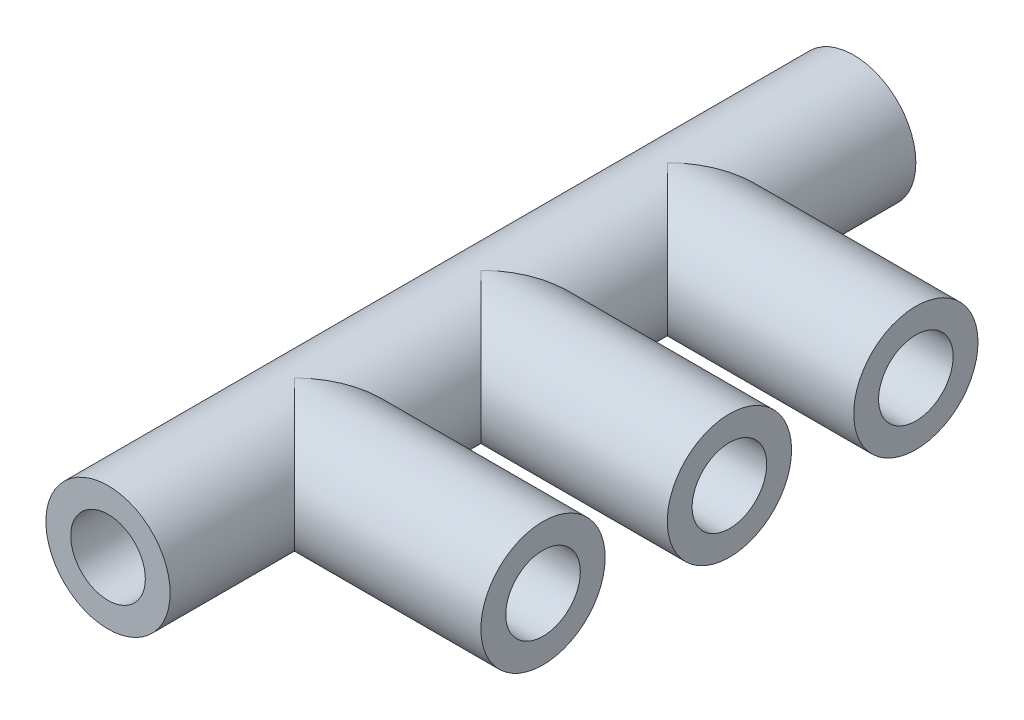
ISO-10303-21;
HEADER;
FILE_DESCRIPTION(('STEP AP214'),'2;1');
FILE_NAME('part.step','',(''),(''),'','','');
FILE_SCHEMA(('AUTOMOTIVE_DESIGN { 1 0 10303 214 1 1 1 1 }'));
ENDSEC;
DATA;
#1=APPLICATION_CONTEXT('core data for automotive mechanical design processes');
#2=APPLICATION_PROTOCOL_DEFINITION('international standard','automotive_design',2000,#1);
#3=PRODUCT_CONTEXT('',#1,'mechanical');
#4=PRODUCT('Part','Part','',(#3));
#5=PRODUCT_RELATED_PRODUCT_CATEGORY('part','',(#4));
#6=PRODUCT_DEFINITION_FORMATION('','',#4);
#7=PRODUCT_DEFINITION_CONTEXT('part definition',#1,'design');
#8=PRODUCT_DEFINITION('design','',#6,#7);
#9=PRODUCT_DEFINITION_SHAPE('','',#8);
#10=(LENGTH_UNIT() NAMED_UNIT(*) SI_UNIT(.MILLI.,.METRE.));
#11=(NAMED_UNIT(*) PLANE_ANGLE_UNIT() SI_UNIT($,.RADIAN.));
#12=(NAMED_UNIT(*) SI_UNIT($,.STERADIAN.) SOLID_ANGLE_UNIT());
#13=UNCERTAINTY_MEASURE_WITH_UNIT(LENGTH_MEASURE(1.E-05),#10,'distance_accuracy_value','');
#14=(GEOMETRIC_REPRESENTATION_CONTEXT(3) GLOBAL_UNCERTAINTY_ASSIGNED_CONTEXT((#13)) GLOBAL_UNIT_ASSIGNED_CONTEXT((#10,
#11,#12)) REPRESENTATION_CONTEXT('',''));
#15=CARTESIAN_POINT('',(0.,0.,0.));
#16=DIRECTION('',(0.,0.,1.));
#17=DIRECTION('',(1.,0.,0.));
#18=AXIS2_PLACEMENT_3D('',#15,#16,#17);
#19=CARTESIAN_POINT('',(0.,0.,60.));
#20=DIRECTION('',(0.,0.,-1.));
#21=DIRECTION('',(-1.,0.,0.));
#22=AXIS2_PLACEMENT_3D('',#19,#20,#21);
#23=CYLINDRICAL_SURFACE('',#22,5.);
#24=CARTESIAN_POINT('',(0.,0.,30.));
#25=DIRECTION('',(-0.707106781186547,0.,-0.707106781186547));
#26=DIRECTION('',(0.707106781186547,0.,-0.707106781186547));
#27=AXIS2_PLACEMENT_3D('',#24,#25,#26);
#28=ELLIPSE('',#27,7.07106781186547,5.);
#29=CARTESIAN_POINT('',(0.,-5.,30.));
#30=VERTEX_POINT('',#29);
#31=CARTESIAN_POINT('',(0.,5.,30.));
#32=VERTEX_POINT('',#31);
#33=EDGE_CURVE('E141',#30,#32,#28,.F.);
#34=ORIENTED_EDGE('',*,*,#33,.F.);
#35=CARTESIAN_POINT('',(0.,0.,30.));
#36=DIRECTION('',(0.707106781186547,0.,-0.707106781186547));
#37=DIRECTION('',(-0.707106781186547,0.,-0.707106781186547));
#38=AXIS2_PLACEMENT_3D('',#35,#36,#37);
#39=ELLIPSE('',#38,7.07106781186547,5.);
#40=EDGE_CURVE('E51',#32,#30,#39,.T.);
#41=ORIENTED_EDGE('',*,*,#40,.F.);
#42=EDGE_LOOP('',(#34,#41));
#43=FACE_BOUND('',#42,.T.);
#44=CARTESIAN_POINT('',(0.,0.,0.));
#45=DIRECTION('',(0.,0.,1.));
#46=DIRECTION('',(1.,0.,0.));
#47=AXIS2_PLACEMENT_3D('',#44,#45,#46);
#48=CIRCLE('',#47,5.);
#49=CARTESIAN_POINT('',(5.,0.,0.));
#50=VERTEX_POINT('',#49);
#51=EDGE_CURVE('E128',#50,#50,#48,.T.);
#52=ORIENTED_EDGE('',*,*,#51,.T.);
#53=EDGE_LOOP('',(#52));
#54=FACE_BOUND('',#53,.T.);
#55=CARTESIAN_POINT('',(0.,0.,60.));
#56=DIRECTION('',(0.,0.,1.));
#57=DIRECTION('',(1.,0.,0.));
#58=AXIS2_PLACEMENT_3D('',#55,#56,#57);
#59=CIRCLE('',#58,5.);
#60=CARTESIAN_POINT('',(5.,0.,60.));
#61=VERTEX_POINT('',#60);
#62=EDGE_CURVE('E129',#61,#61,#59,.T.);
#63=ORIENTED_EDGE('',*,*,#62,.F.);
#64=EDGE_LOOP('',(#63));
#65=FACE_BOUND('',#64,.T.);
#66=CARTESIAN_POINT('',(0.,0.,15.));
#67=DIRECTION('',(-0.707106781186547,0.,-0.707106781186547));
#68=DIRECTION('',(0.707106781186547,0.,-0.707106781186547));
#69=AXIS2_PLACEMENT_3D('',#66,#67,#68);
#70=ELLIPSE('',#69,7.07106781186547,5.);
#71=CARTESIAN_POINT('',(0.,-5.,15.));
#72=VERTEX_POINT('',#71);
#73=CARTESIAN_POINT('',(0.,5.,15.));
#74=VERTEX_POINT('',#73);
#75=EDGE_CURVE('E137',#72,#74,#70,.F.);
#76=ORIENTED_EDGE('',*,*,#75,.F.);
#77=CARTESIAN_POINT('',(0.,0.,15.));
#78=DIRECTION('',(0.707106781186547,0.,-0.707106781186547));
#79=DIRECTION('',(-0.707106781186547,0.,-0.707106781186547));
#80=AXIS2_PLACEMENT_3D('',#77,#78,#79);
#81=ELLIPSE('',#80,7.07106781186547,5.);
#82=EDGE_CURVE('E132',#74,#72,#81,.T.);
#83=ORIENTED_EDGE('',*,*,#82,.F.);
#84=EDGE_LOOP('',(#76,#83));
#85=FACE_BOUND('',#84,.T.);
#86=CARTESIAN_POINT('',(0.,0.,45.));
#87=DIRECTION('',(-0.707106781186547,0.,-0.707106781186547));
#88=DIRECTION('',(0.707106781186547,0.,-0.707106781186547));
#89=AXIS2_PLACEMENT_3D('',#86,#87,#88);
#90=ELLIPSE('',#89,7.07106781186547,5.);
#91=CARTESIAN_POINT('',(0.,-5.,45.));
#92=VERTEX_POINT('',#91);
#93=CARTESIAN_POINT('',(0.,5.,45.));
#94=VERTEX_POINT('',#93);
#95=EDGE_CURVE('E11',#92,#94,#90,.F.);
#96=ORIENTED_EDGE('',*,*,#95,.F.);
#97=CARTESIAN_POINT('',(0.,0.,45.));
#98=DIRECTION('',(0.707106781186547,0.,-0.707106781186547));
#99=DIRECTION('',(-0.707106781186547,0.,-0.707106781186547));
#100=AXIS2_PLACEMENT_3D('',#97,#98,#99);
#101=ELLIPSE('',#100,7.07106781186547,5.);
#102=EDGE_CURVE('E40',#94,#92,#101,.T.);
#103=ORIENTED_EDGE('',*,*,#102,.F.);
#104=EDGE_LOOP('',(#96,#103));
#105=FACE_BOUND('',#104,.T.);
#106=ADVANCED_FACE('F33',(#43,#54,#65,#85,#105),#23,.T.);
#107=CARTESIAN_POINT('',(0.,0.,60.));
#108=DIRECTION('',(0.,0.,1.));
#109=DIRECTION('',(1.,0.,0.));
#110=AXIS2_PLACEMENT_3D('',#107,#108,#109);
#111=PLANE('',#110);
#112=CARTESIAN_POINT('',(0.,0.,60.));
#113=DIRECTION('',(0.,0.,1.));
#114=DIRECTION('',(1.,0.,0.));
#115=AXIS2_PLACEMENT_3D('',#112,#113,#114);
#116=CIRCLE('',#115,3.);
#117=CARTESIAN_POINT('',(3.,0.,60.));
#118=VERTEX_POINT('',#117);
#119=EDGE_CURVE('E99',#118,#118,#116,.T.);
#120=ORIENTED_EDGE('',*,*,#119,.F.);
#121=EDGE_LOOP('',(#120));
#122=FACE_BOUND('',#121,.T.);
#123=ORIENTED_EDGE('',*,*,#62,.T.);
#124=EDGE_LOOP('',(#123));
#125=FACE_BOUND('',#124,.T.);
#126=ADVANCED_FACE('F145',(#122,#125),#111,.T.);
#127=CARTESIAN_POINT('',(0.,0.,0.));
#128=DIRECTION('',(0.,0.,1.));
#129=DIRECTION('',(1.,0.,0.));
#130=AXIS2_PLACEMENT_3D('',#127,#128,#129);
#131=PLANE('',#130);
#132=CARTESIAN_POINT('',(0.,0.,0.));
#133=DIRECTION('',(0.,0.,1.));
#134=DIRECTION('',(1.,0.,0.));
#135=AXIS2_PLACEMENT_3D('',#132,#133,#134);
#136=CIRCLE('',#135,3.);
#137=CARTESIAN_POINT('',(3.,0.,0.));
#138=VERTEX_POINT('',#137);
#139=EDGE_CURVE('E106',#138,#138,#136,.T.);
#140=ORIENTED_EDGE('',*,*,#139,.T.);
#141=EDGE_LOOP('',(#140));
#142=FACE_BOUND('',#141,.T.);
#143=ORIENTED_EDGE('',*,*,#51,.F.);
#144=EDGE_LOOP('',(#143));
#145=FACE_BOUND('',#144,.T.);
#146=ADVANCED_FACE('F149',(#142,#145),#131,.F.);
#147=CARTESIAN_POINT('',(20.,0.,15.));
#148=DIRECTION('',(-1.,0.,0.));
#149=DIRECTION('',(0.,0.,1.));
#150=AXIS2_PLACEMENT_3D('',#147,#148,#149);
#151=CYLINDRICAL_SURFACE('',#150,5.);
#152=CARTESIAN_POINT('',(20.,0.,15.));
#153=DIRECTION('',(1.,0.,0.));
#154=DIRECTION('',(0.,0.,-1.));
#155=AXIS2_PLACEMENT_3D('',#152,#153,#154);
#156=CIRCLE('',#155,5.);
#157=CARTESIAN_POINT('',(20.,0.,10.));
#158=VERTEX_POINT('',#157);
#159=EDGE_CURVE('E125',#158,#158,#156,.T.);
#160=ORIENTED_EDGE('',*,*,#159,.F.);
#161=EDGE_LOOP('',(#160));
#162=FACE_BOUND('',#161,.T.);
#163=ORIENTED_EDGE('',*,*,#82,.T.);
#164=ORIENTED_EDGE('',*,*,#75,.T.);
#165=EDGE_LOOP('',(#163,#164));
#166=FACE_BOUND('',#165,.T.);
#167=ADVANCED_FACE('F158',(#162,#166),#151,.T.);
#168=CARTESIAN_POINT('',(20.,0.,15.));
#169=DIRECTION('',(1.,0.,0.));
#170=DIRECTION('',(0.,0.,-1.));
#171=AXIS2_PLACEMENT_3D('',#168,#169,#170);
#172=PLANE('',#171);
#173=CARTESIAN_POINT('',(20.,0.,15.));
#174=DIRECTION('',(1.,0.,0.));
#175=DIRECTION('',(0.,0.,-1.));
#176=AXIS2_PLACEMENT_3D('',#173,#174,#175);
#177=CIRCLE('',#176,3.);
#178=CARTESIAN_POINT('',(20.,0.,12.));
#179=VERTEX_POINT('',#178);
#180=EDGE_CURVE('E109',#179,#179,#177,.T.);
#181=ORIENTED_EDGE('',*,*,#180,.F.);
#182=EDGE_LOOP('',(#181));
#183=FACE_BOUND('',#182,.T.);
#184=ORIENTED_EDGE('',*,*,#159,.T.);
#185=EDGE_LOOP('',(#184));
#186=FACE_BOUND('',#185,.T.);
#187=ADVANCED_FACE('F160',(#183,#186),#172,.T.);
#188=CARTESIAN_POINT('',(20.,0.,30.));
#189=DIRECTION('',(-1.,0.,0.));
#190=DIRECTION('',(0.,0.,1.));
#191=AXIS2_PLACEMENT_3D('',#188,#189,#190);
#192=CYLINDRICAL_SURFACE('',#191,5.);
#193=CARTESIAN_POINT('',(20.,0.,30.));
#194=DIRECTION('',(1.,0.,0.));
#195=DIRECTION('',(0.,0.,-1.));
#196=AXIS2_PLACEMENT_3D('',#193,#194,#195);
#197=CIRCLE('',#196,5.);
#198=CARTESIAN_POINT('',(20.,0.,25.));
#199=VERTEX_POINT('',#198);
#200=EDGE_CURVE('E122',#199,#199,#197,.T.);
#201=ORIENTED_EDGE('',*,*,#200,.F.);
#202=EDGE_LOOP('',(#201));
#203=FACE_BOUND('',#202,.T.);
#204=ORIENTED_EDGE('',*,*,#40,.T.);
#205=ORIENTED_EDGE('',*,*,#33,.T.);
#206=EDGE_LOOP('',(#204,#205));
#207=FACE_BOUND('',#206,.T.);
#208=ADVANCED_FACE('F167',(#203,#207),#192,.T.);
#209=CARTESIAN_POINT('',(20.,0.,30.));
#210=DIRECTION('',(1.,0.,0.));
#211=DIRECTION('',(0.,0.,-1.));
#212=AXIS2_PLACEMENT_3D('',#209,#210,#211);
#213=PLANE('',#212);
#214=CARTESIAN_POINT('',(20.,0.,30.));
#215=DIRECTION('',(1.,0.,0.));
#216=DIRECTION('',(0.,0.,-1.));
#217=AXIS2_PLACEMENT_3D('',#214,#215,#216);
#218=CIRCLE('',#217,3.);
#219=CARTESIAN_POINT('',(20.,0.,27.));
#220=VERTEX_POINT('',#219);
#221=EDGE_CURVE('E114',#220,#220,#218,.T.);
#222=ORIENTED_EDGE('',*,*,#221,.F.);
#223=EDGE_LOOP('',(#222));
#224=FACE_BOUND('',#223,.T.);
#225=ORIENTED_EDGE('',*,*,#200,.T.);
#226=EDGE_LOOP('',(#225));
#227=FACE_BOUND('',#226,.T.);
#228=ADVANCED_FACE('F175',(#224,#227),#213,.T.);
#229=CARTESIAN_POINT('',(20.,0.,45.));
#230=DIRECTION('',(-1.,0.,0.));
#231=DIRECTION('',(0.,0.,1.));
#232=AXIS2_PLACEMENT_3D('',#229,#230,#231);
#233=CYLINDRICAL_SURFACE('',#232,5.);
#234=CARTESIAN_POINT('',(20.,0.,45.));
#235=DIRECTION('',(1.,0.,0.));
#236=DIRECTION('',(0.,0.,-1.));
#237=AXIS2_PLACEMENT_3D('',#234,#235,#236);
#238=CIRCLE('',#237,5.);
#239=CARTESIAN_POINT('',(20.,0.,40.));
#240=VERTEX_POINT('',#239);
#241=EDGE_CURVE('E103',#240,#240,#238,.T.);
#242=ORIENTED_EDGE('',*,*,#241,.F.);
#243=EDGE_LOOP('',(#242));
#244=FACE_BOUND('',#243,.T.);
#245=ORIENTED_EDGE('',*,*,#102,.T.);
#246=ORIENTED_EDGE('',*,*,#95,.T.);
#247=EDGE_LOOP('',(#245,#246));
#248=FACE_BOUND('',#247,.T.);
#249=ADVANCED_FACE('F143',(#244,#248),#233,.T.);
#250=CARTESIAN_POINT('',(20.,0.,45.));
#251=DIRECTION('',(1.,0.,0.));
#252=DIRECTION('',(0.,0.,-1.));
#253=AXIS2_PLACEMENT_3D('',#250,#251,#252);
#254=PLANE('',#253);
#255=CARTESIAN_POINT('',(20.,0.,45.));
#256=DIRECTION('',(1.,0.,0.));
#257=DIRECTION('',(0.,0.,-1.));
#258=AXIS2_PLACEMENT_3D('',#255,#256,#257);
#259=CIRCLE('',#258,3.);
#260=CARTESIAN_POINT('',(20.,0.,42.));
#261=VERTEX_POINT('',#260);
#262=EDGE_CURVE('E117',#261,#261,#259,.T.);
#263=ORIENTED_EDGE('',*,*,#262,.F.);
#264=EDGE_LOOP('',(#263));
#265=FACE_BOUND('',#264,.T.);
#266=ORIENTED_EDGE('',*,*,#241,.T.);
#267=EDGE_LOOP('',(#266));
#268=FACE_BOUND('',#267,.T.);
#269=ADVANCED_FACE('F182',(#265,#268),#254,.T.);
#270=CARTESIAN_POINT('',(0.,0.,60.));
#271=DIRECTION('',(0.,0.,-1.));
#272=DIRECTION('',(-1.,0.,0.));
#273=AXIS2_PLACEMENT_3D('',#270,#271,#272);
#274=CYLINDRICAL_SURFACE('',#273,3.);
#275=CARTESIAN_POINT('',(0.,0.,30.));
#276=DIRECTION('',(-0.707106781186547,0.,-0.707106781186547));
#277=DIRECTION('',(0.707106781186547,0.,-0.707106781186547));
#278=AXIS2_PLACEMENT_3D('',#275,#276,#277);
#279=ELLIPSE('',#278,4.24264068711928,3.);
#280=CARTESIAN_POINT('',(0.,-3.,30.));
#281=VERTEX_POINT('',#280);
#282=CARTESIAN_POINT('',(0.,3.,30.));
#283=VERTEX_POINT('',#282);
#284=EDGE_CURVE('E82',#281,#283,#279,.F.);
#285=ORIENTED_EDGE('',*,*,#284,.T.);
#286=CARTESIAN_POINT('',(0.,0.,30.));
#287=DIRECTION('',(0.707106781186547,0.,-0.707106781186547));
#288=DIRECTION('',(-0.707106781186547,0.,-0.707106781186547));
#289=AXIS2_PLACEMENT_3D('',#286,#287,#288);
#290=ELLIPSE('',#289,4.24264068711928,3.);
#291=EDGE_CURVE('E85',#283,#281,#290,.T.);
#292=ORIENTED_EDGE('',*,*,#291,.T.);
#293=EDGE_LOOP('',(#285,#292));
#294=FACE_BOUND('',#293,.T.);
#295=ORIENTED_EDGE('',*,*,#139,.F.);
#296=EDGE_LOOP('',(#295));
#297=FACE_BOUND('',#296,.T.);
#298=ORIENTED_EDGE('',*,*,#119,.T.);
#299=EDGE_LOOP('',(#298));
#300=FACE_BOUND('',#299,.T.);
#301=CARTESIAN_POINT('',(0.,0.,15.));
#302=DIRECTION('',(-0.707106781186547,0.,-0.707106781186547));
#303=DIRECTION('',(0.707106781186547,0.,-0.707106781186547));
#304=AXIS2_PLACEMENT_3D('',#301,#302,#303);
#305=ELLIPSE('',#304,4.24264068711928,3.);
#306=CARTESIAN_POINT('',(0.,-3.,15.));
#307=VERTEX_POINT('',#306);
#308=CARTESIAN_POINT('',(0.,3.,15.));
#309=VERTEX_POINT('',#308);
#310=EDGE_CURVE('E91',#307,#309,#305,.F.);
#311=ORIENTED_EDGE('',*,*,#310,.T.);
#312=CARTESIAN_POINT('',(0.,0.,15.));
#313=DIRECTION('',(0.707106781186547,0.,-0.707106781186547));
#314=DIRECTION('',(-0.707106781186547,0.,-0.707106781186547));
#315=AXIS2_PLACEMENT_3D('',#312,#313,#314);
#316=ELLIPSE('',#315,4.24264068711928,3.);
#317=EDGE_CURVE('E94',#309,#307,#316,.T.);
#318=ORIENTED_EDGE('',*,*,#317,.T.);
#319=EDGE_LOOP('',(#311,#318));
#320=FACE_BOUND('',#319,.T.);
#321=CARTESIAN_POINT('',(0.,0.,45.));
#322=DIRECTION('',(-0.707106781186547,0.,-0.707106781186547));
#323=DIRECTION('',(0.707106781186547,0.,-0.707106781186547));
#324=AXIS2_PLACEMENT_3D('',#321,#322,#323);
#325=ELLIPSE('',#324,4.24264068711928,3.);
#326=CARTESIAN_POINT('',(0.,-3.,45.));
#327=VERTEX_POINT('',#326);
#328=CARTESIAN_POINT('',(0.,3.,45.));
#329=VERTEX_POINT('',#328);
#330=EDGE_CURVE('E100',#327,#329,#325,.F.);
#331=ORIENTED_EDGE('',*,*,#330,.T.);
#332=CARTESIAN_POINT('',(0.,0.,45.));
#333=DIRECTION('',(0.707106781186547,0.,-0.707106781186547));
#334=DIRECTION('',(-0.707106781186547,0.,-0.707106781186547));
#335=AXIS2_PLACEMENT_3D('',#332,#333,#334);
#336=ELLIPSE('',#335,4.24264068711928,3.);
#337=EDGE_CURVE('E87',#329,#327,#336,.T.);
#338=ORIENTED_EDGE('',*,*,#337,.T.);
#339=EDGE_LOOP('',(#331,#338));
#340=FACE_BOUND('',#339,.T.);
#341=ADVANCED_FACE('F89',(#294,#297,#300,#320,#340),#274,.F.);
#342=CARTESIAN_POINT('',(20.,0.,15.));
#343=DIRECTION('',(-1.,0.,0.));
#344=DIRECTION('',(0.,0.,1.));
#345=AXIS2_PLACEMENT_3D('',#342,#343,#344);
#346=CYLINDRICAL_SURFACE('',#345,3.);
#347=ORIENTED_EDGE('',*,*,#180,.T.);
#348=EDGE_LOOP('',(#347));
#349=FACE_BOUND('',#348,.T.);
#350=ORIENTED_EDGE('',*,*,#317,.F.);
#351=ORIENTED_EDGE('',*,*,#310,.F.);
#352=EDGE_LOOP('',(#350,#351));
#353=FACE_BOUND('',#352,.T.);
#354=ADVANCED_FACE('F193',(#349,#353),#346,.F.);
#355=CARTESIAN_POINT('',(20.,0.,30.));
#356=DIRECTION('',(-1.,0.,0.));
#357=DIRECTION('',(0.,0.,1.));
#358=AXIS2_PLACEMENT_3D('',#355,#356,#357);
#359=CYLINDRICAL_SURFACE('',#358,3.);
#360=ORIENTED_EDGE('',*,*,#221,.T.);
#361=EDGE_LOOP('',(#360));
#362=FACE_BOUND('',#361,.T.);
#363=ORIENTED_EDGE('',*,*,#291,.F.);
#364=ORIENTED_EDGE('',*,*,#284,.F.);
#365=EDGE_LOOP('',(#363,#364));
#366=FACE_BOUND('',#365,.T.);
#367=ADVANCED_FACE('F84',(#362,#366),#359,.F.);
#368=CARTESIAN_POINT('',(20.,0.,45.));
#369=DIRECTION('',(-1.,0.,0.));
#370=DIRECTION('',(0.,0.,1.));
#371=AXIS2_PLACEMENT_3D('',#368,#369,#370);
#372=CYLINDRICAL_SURFACE('',#371,3.);
#373=ORIENTED_EDGE('',*,*,#262,.T.);
#374=EDGE_LOOP('',(#373));
#375=FACE_BOUND('',#374,.T.);
#376=ORIENTED_EDGE('',*,*,#337,.F.);
#377=ORIENTED_EDGE('',*,*,#330,.F.);
#378=EDGE_LOOP('',(#376,#377));
#379=FACE_BOUND('',#378,.T.);
#380=ADVANCED_FACE('F187',(#375,#379),#372,.F.);
#381=CLOSED_SHELL('',(#106,#126,#146,#167,#187,#208,#228,#249,#269,#341,#354,#367,#380));
#382=MANIFOLD_SOLID_BREP('B2',#381);
#383=ADVANCED_BREP_SHAPE_REPRESENTATION('',(#18,#382),#14);
#384=SHAPE_DEFINITION_REPRESENTATION(#9,#383);
ENDSEC;
END-ISO-10303-21;
